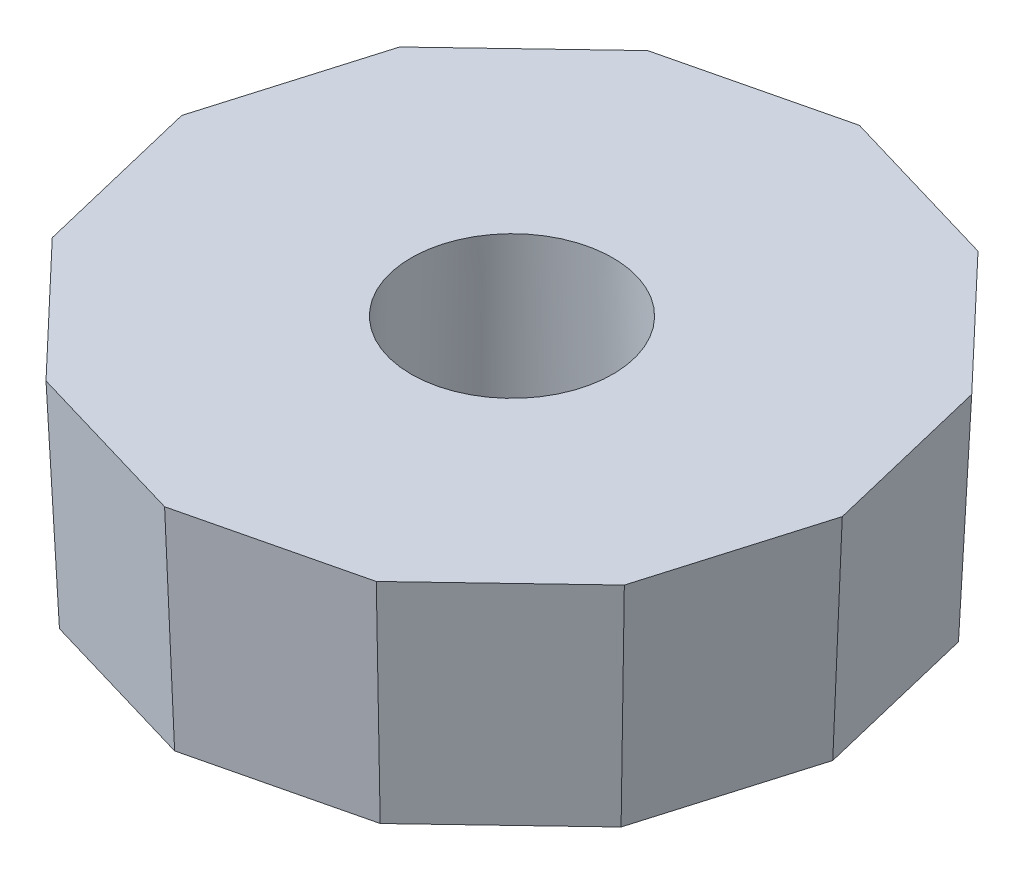
ISO-10303-21;
HEADER;
FILE_DESCRIPTION(('STEP AP214'),'2;1');
FILE_NAME('part.step','',(''),(''),'','','');
FILE_SCHEMA(('AUTOMOTIVE_DESIGN { 1 0 10303 214 1 1 1 1 }'));
ENDSEC;
DATA;
#1=APPLICATION_CONTEXT('core data for automotive mechanical design processes');
#2=APPLICATION_PROTOCOL_DEFINITION('international standard','automotive_design',2000,#1);
#3=PRODUCT_CONTEXT('',#1,'mechanical');
#4=PRODUCT('Part','Part','',(#3));
#5=PRODUCT_RELATED_PRODUCT_CATEGORY('part','',(#4));
#6=PRODUCT_DEFINITION_FORMATION('','',#4);
#7=PRODUCT_DEFINITION_CONTEXT('part definition',#1,'design');
#8=PRODUCT_DEFINITION('design','',#6,#7);
#9=PRODUCT_DEFINITION_SHAPE('','',#8);
#10=(LENGTH_UNIT() NAMED_UNIT(*) SI_UNIT(.MILLI.,.METRE.));
#11=(NAMED_UNIT(*) PLANE_ANGLE_UNIT() SI_UNIT($,.RADIAN.));
#12=(NAMED_UNIT(*) SI_UNIT($,.STERADIAN.) SOLID_ANGLE_UNIT());
#13=UNCERTAINTY_MEASURE_WITH_UNIT(LENGTH_MEASURE(1.E-05),#10,'distance_accuracy_value','');
#14=(GEOMETRIC_REPRESENTATION_CONTEXT(3) GLOBAL_UNCERTAINTY_ASSIGNED_CONTEXT((#13)) GLOBAL_UNIT_ASSIGNED_CONTEXT((#10,
#11,#12)) REPRESENTATION_CONTEXT('',''));
#15=CARTESIAN_POINT('',(0.,0.,0.));
#16=DIRECTION('',(0.,0.,1.));
#17=DIRECTION('',(1.,0.,0.));
#18=AXIS2_PLACEMENT_3D('',#15,#16,#17);
#19=CARTESIAN_POINT('',(0.,6.35,0.));
#20=DIRECTION('',(0.,1.,0.));
#21=DIRECTION('',(0.,0.,1.));
#22=AXIS2_PLACEMENT_3D('',#19,#20,#21);
#23=PLANE('',#22);
#24=DIRECTION('',(-0.724747065615518,0.,0.689015014990019));
#25=VECTOR('',#24,1.);
#26=CARTESIAN_POINT('',(4.81065623202276,6.35,8.69078128216615));
#27=LINE('',#26,#25);
#28=CARTESIAN_POINT('',(4.75681614490191,6.35,8.74196690290838));
#29=VERTEX_POINT('',#28);
#30=CARTESIAN_POINT('',(8.4905070740712,6.35,5.19235734451046));
#31=VERTEX_POINT('',#30);
#32=EDGE_CURVE('E187',#29,#31,#27,.F.);
#33=ORIENTED_EDGE('',*,*,#32,.T.);
#34=DIRECTION('',(-0.283141862646256,0.,0.959078039378031));
#35=VECTOR('',#34,1.);
#36=CARTESIAN_POINT('',(8.51154114688871,6.35,5.1211092530788));
#37=LINE('',#36,#35);
#38=CARTESIAN_POINT('',(9.94917348941238,6.35,0.251459828837172));
#39=VERTEX_POINT('',#38);
#40=EDGE_CURVE('E146',#31,#39,#37,.F.);
#41=ORIENTED_EDGE('',*,*,#40,.T.);
#42=DIRECTION('',(0.234330973762514,0.,0.972156877636275));
#43=VECTOR('',#42,1.);
#44=CARTESIAN_POINT('',(9.93176548510156,6.35,0.17924013527744));
#45=LINE('',#44,#43);
#46=CARTESIAN_POINT('',(8.74196690290837,6.35,-4.75681614490191));
#47=VERTEX_POINT('',#46);
#48=EDGE_CURVE('E233',#39,#47,#45,.F.);
#49=ORIENTED_EDGE('',*,*,#48,.T.);
#50=DIRECTION('',(0.689015014990019,0.,0.724747065615518));
#51=VECTOR('',#50,1.);
#52=CARTESIAN_POINT('',(8.69078128216615,6.35,-4.81065623202276));
#53=LINE('',#52,#51);
#54=CARTESIAN_POINT('',(5.19235734451046,6.35,-8.4905070740712));
#55=VERTEX_POINT('',#54);
#56=EDGE_CURVE('E236',#47,#55,#53,.F.);
#57=ORIENTED_EDGE('',*,*,#56,.T.);
#58=DIRECTION('',(0.959078039378031,0.,0.283141862646256));
#59=VECTOR('',#58,1.);
#60=CARTESIAN_POINT('',(5.1211092530788,6.35,-8.51154114688871));
#61=LINE('',#60,#59);
#62=CARTESIAN_POINT('',(0.25145982883717,6.35,-9.94917348941238));
#63=VERTEX_POINT('',#62);
#64=EDGE_CURVE('E239',#55,#63,#61,.F.);
#65=ORIENTED_EDGE('',*,*,#64,.T.);
#66=DIRECTION('',(0.972156877636275,0.,-0.234330973762514));
#67=VECTOR('',#66,1.);
#68=CARTESIAN_POINT('',(0.179240135277437,6.35,-9.93176548510156));
#69=LINE('',#68,#67);
#70=CARTESIAN_POINT('',(-4.75681614490192,6.35,-8.74196690290837));
#71=VERTEX_POINT('',#70);
#72=EDGE_CURVE('E242',#63,#71,#69,.F.);
#73=ORIENTED_EDGE('',*,*,#72,.T.);
#74=DIRECTION('',(0.724747065615518,0.,-0.689015014990019));
#75=VECTOR('',#74,1.);
#76=CARTESIAN_POINT('',(-4.81065623202276,6.35,-8.69078128216615));
#77=LINE('',#76,#75);
#78=CARTESIAN_POINT('',(-8.4905070740712,6.35,-5.19235734451046));
#79=VERTEX_POINT('',#78);
#80=EDGE_CURVE('E245',#71,#79,#77,.F.);
#81=ORIENTED_EDGE('',*,*,#80,.T.);
#82=DIRECTION('',(0.283141862646257,0.,-0.959078039378031));
#83=VECTOR('',#82,1.);
#84=CARTESIAN_POINT('',(-8.51154114688871,6.35,-5.1211092530788));
#85=LINE('',#84,#83);
#86=CARTESIAN_POINT('',(-9.94917348941238,6.35,-0.251459828837181));
#87=VERTEX_POINT('',#86);
#88=EDGE_CURVE('E248',#79,#87,#85,.F.);
#89=ORIENTED_EDGE('',*,*,#88,.T.);
#90=DIRECTION('',(-0.234330973762514,0.,-0.972156877636276));
#91=VECTOR('',#90,1.);
#92=CARTESIAN_POINT('',(-9.93176548510156,6.35,-0.179240135277448));
#93=LINE('',#92,#91);
#94=CARTESIAN_POINT('',(-8.74196690290837,6.35,4.75681614490192));
#95=VERTEX_POINT('',#94);
#96=EDGE_CURVE('E251',#87,#95,#93,.F.);
#97=ORIENTED_EDGE('',*,*,#96,.T.);
#98=DIRECTION('',(-0.68901501499002,0.,-0.724747065615517));
#99=VECTOR('',#98,1.);
#100=CARTESIAN_POINT('',(-8.69078128216615,6.35,4.81065623202276));
#101=LINE('',#100,#99);
#102=CARTESIAN_POINT('',(-5.19235734451046,6.35,8.4905070740712));
#103=VERTEX_POINT('',#102);
#104=EDGE_CURVE('E254',#95,#103,#101,.F.);
#105=ORIENTED_EDGE('',*,*,#104,.T.);
#106=DIRECTION('',(-0.959078039378031,0.,-0.283141862646256));
#107=VECTOR('',#106,1.);
#108=CARTESIAN_POINT('',(-5.1211092530788,6.35,8.51154114688871));
#109=LINE('',#108,#107);
#110=CARTESIAN_POINT('',(-0.251459828837165,6.35,9.94917348941238));
#111=VERTEX_POINT('',#110);
#112=EDGE_CURVE('E62',#103,#111,#109,.F.);
#113=ORIENTED_EDGE('',*,*,#112,.T.);
#114=DIRECTION('',(-0.972156877636276,0.,0.234330973762514));
#115=VECTOR('',#114,1.);
#116=CARTESIAN_POINT('',(-0.179240135277432,6.35,9.93176548510156));
#117=LINE('',#116,#115);
#118=EDGE_CURVE('E57',#111,#29,#117,.F.);
#119=ORIENTED_EDGE('',*,*,#118,.T.);
#120=EDGE_LOOP('',(#33,#41,#49,#57,#65,#73,#81,#89,#97,#105,#113,#119));
#121=FACE_BOUND('',#120,.T.);
#122=CARTESIAN_POINT('',(0.,6.35,0.));
#123=DIRECTION('',(0.,1.,0.));
#124=DIRECTION('',(0.,0.,1.));
#125=AXIS2_PLACEMENT_3D('',#122,#123,#124);
#126=CIRCLE('',#125,2.96125301253095);
#127=CARTESIAN_POINT('',(0.,6.35,2.96125301253095));
#128=VERTEX_POINT('',#127);
#129=EDGE_CURVE('E43',#128,#128,#126,.T.);
#130=ORIENTED_EDGE('',*,*,#129,.F.);
#131=EDGE_LOOP('',(#130));
#132=FACE_BOUND('',#131,.T.);
#133=ADVANCED_FACE('F39',(#121,#132),#23,.T.);
#134=CARTESIAN_POINT('',(0.,0.,0.));
#135=DIRECTION('',(0.,1.,0.));
#136=DIRECTION('',(0.,0.,1.));
#137=AXIS2_PLACEMENT_3D('',#134,#135,#136);
#138=PLANE('',#137);
#139=DIRECTION('',(0.724747065615518,0.,-0.689015014990019));
#140=VECTOR('',#139,1.);
#141=CARTESIAN_POINT('',(4.61962889479583,0.,8.48984734154722));
#142=LINE('',#141,#140);
#143=CARTESIAN_POINT('',(4.61962889479583,0.,8.48984734154722));
#144=VERTEX_POINT('',#143);
#145=CARTESIAN_POINT('',(8.24563964972343,0.,5.04260902463375));
#146=VERTEX_POINT('',#145);
#147=EDGE_CURVE('E136',#144,#146,#142,.T.);
#148=ORIENTED_EDGE('',*,*,#147,.F.);
#149=DIRECTION('',(0.972156877636275,0.,-0.234330973762513));
#150=VECTOR('',#149,1.);
#151=CARTESIAN_POINT('',(-0.244207691823778,0.,9.66223791942959));
#152=LINE('',#151,#150);
#153=CARTESIAN_POINT('',(-0.244207691823778,0.,9.66223791942959));
#154=VERTEX_POINT('',#153);
#155=EDGE_CURVE('E185',#154,#144,#152,.T.);
#156=ORIENTED_EDGE('',*,*,#155,.F.);
#157=DIRECTION('',(0.959078039378031,0.,0.283141862646256));
#158=VECTOR('',#157,1.);
#159=CARTESIAN_POINT('',(-5.04260902463375,0.,8.24563964972343));
#160=LINE('',#159,#158);
#161=CARTESIAN_POINT('',(-5.04260902463375,0.,8.24563964972343));
#162=VERTEX_POINT('',#161);
#163=EDGE_CURVE('E182',#162,#154,#160,.T.);
#164=ORIENTED_EDGE('',*,*,#163,.F.);
#165=DIRECTION('',(0.68901501499002,0.,0.724747065615517));
#166=VECTOR('',#165,1.);
#167=CARTESIAN_POINT('',(-8.48984734154721,0.,4.61962889479584));
#168=LINE('',#167,#166);
#169=CARTESIAN_POINT('',(-8.48984734154721,0.,4.61962889479584));
#170=VERTEX_POINT('',#169);
#171=EDGE_CURVE('E179',#170,#162,#168,.T.);
#172=ORIENTED_EDGE('',*,*,#171,.F.);
#173=DIRECTION('',(0.234330973762514,0.,0.972156877636276));
#174=VECTOR('',#173,1.);
#175=CARTESIAN_POINT('',(-9.66223791942959,0.,-0.244207691823794));
#176=LINE('',#175,#174);
#177=CARTESIAN_POINT('',(-9.66223791942959,0.,-0.244207691823794));
#178=VERTEX_POINT('',#177);
#179=EDGE_CURVE('E176',#178,#170,#176,.T.);
#180=ORIENTED_EDGE('',*,*,#179,.F.);
#181=DIRECTION('',(-0.283141862646257,0.,0.959078039378031));
#182=VECTOR('',#181,1.);
#183=CARTESIAN_POINT('',(-8.24563964972343,0.,-5.04260902463375));
#184=LINE('',#183,#182);
#185=CARTESIAN_POINT('',(-8.24563964972343,0.,-5.04260902463375));
#186=VERTEX_POINT('',#185);
#187=EDGE_CURVE('E173',#186,#178,#184,.T.);
#188=ORIENTED_EDGE('',*,*,#187,.F.);
#189=DIRECTION('',(-0.724747065615518,0.,0.689015014990019));
#190=VECTOR('',#189,1.);
#191=CARTESIAN_POINT('',(-4.61962889479584,0.,-8.48984734154721));
#192=LINE('',#191,#190);
#193=CARTESIAN_POINT('',(-4.61962889479584,0.,-8.48984734154721));
#194=VERTEX_POINT('',#193);
#195=EDGE_CURVE('E170',#194,#186,#192,.T.);
#196=ORIENTED_EDGE('',*,*,#195,.F.);
#197=DIRECTION('',(-0.972156877636275,0.,0.234330973762514));
#198=VECTOR('',#197,1.);
#199=CARTESIAN_POINT('',(0.244207691823783,0.,-9.66223791942959));
#200=LINE('',#199,#198);
#201=CARTESIAN_POINT('',(0.244207691823783,0.,-9.66223791942959));
#202=VERTEX_POINT('',#201);
#203=EDGE_CURVE('E167',#202,#194,#200,.T.);
#204=ORIENTED_EDGE('',*,*,#203,.F.);
#205=DIRECTION('',(-0.959078039378031,0.,-0.283141862646256));
#206=VECTOR('',#205,1.);
#207=CARTESIAN_POINT('',(5.04260902463375,0.,-8.24563964972343));
#208=LINE('',#207,#206);
#209=CARTESIAN_POINT('',(5.04260902463375,0.,-8.24563964972343));
#210=VERTEX_POINT('',#209);
#211=EDGE_CURVE('E164',#210,#202,#208,.T.);
#212=ORIENTED_EDGE('',*,*,#211,.F.);
#213=DIRECTION('',(-0.689015014990019,0.,-0.724747065615518));
#214=VECTOR('',#213,1.);
#215=CARTESIAN_POINT('',(8.48984734154721,0.,-4.61962889479583));
#216=LINE('',#215,#214);
#217=CARTESIAN_POINT('',(8.48984734154721,0.,-4.61962889479583));
#218=VERTEX_POINT('',#217);
#219=EDGE_CURVE('E161',#218,#210,#216,.T.);
#220=ORIENTED_EDGE('',*,*,#219,.F.);
#221=DIRECTION('',(-0.234330973762514,0.,-0.972156877636275));
#222=VECTOR('',#221,1.);
#223=CARTESIAN_POINT('',(9.66223791942959,0.,0.244207691823786));
#224=LINE('',#223,#222);
#225=CARTESIAN_POINT('',(9.66223791942959,0.,0.244207691823786));
#226=VERTEX_POINT('',#225);
#227=EDGE_CURVE('E138',#226,#218,#224,.T.);
#228=ORIENTED_EDGE('',*,*,#227,.F.);
#229=DIRECTION('',(0.283141862646256,0.,-0.959078039378031));
#230=VECTOR('',#229,1.);
#231=CARTESIAN_POINT('',(8.24563964972343,0.,5.04260902463375));
#232=LINE('',#231,#230);
#233=EDGE_CURVE('E131',#146,#226,#232,.T.);
#234=ORIENTED_EDGE('',*,*,#233,.F.);
#235=EDGE_LOOP('',(#148,#156,#164,#172,#180,#188,#196,#204,#212,#220,#228,#234));
#236=FACE_BOUND('',#235,.T.);
#237=CARTESIAN_POINT('',(0.,0.,0.));
#238=DIRECTION('',(0.,1.,0.));
#239=DIRECTION('',(0.,0.,1.));
#240=AXIS2_PLACEMENT_3D('',#237,#238,#239);
#241=CIRCLE('',#240,3.2385);
#242=CARTESIAN_POINT('',(0.,0.,3.2385));
#243=VERTEX_POINT('',#242);
#244=EDGE_CURVE('E156',#243,#243,#241,.T.);
#245=ORIENTED_EDGE('',*,*,#244,.T.);
#246=EDGE_LOOP('',(#245));
#247=FACE_BOUND('',#246,.T.);
#248=ADVANCED_FACE('F132',(#236,#247),#138,.F.);
#249=CARTESIAN_POINT('',(4.61962889479583,0.,8.48984734154722));
#250=DIRECTION('',(0.688359225368976,-0.0436193873653361,0.724057266999853));
#251=DIRECTION('',(0.724747065615518,0.,-0.689015014990019));
#252=AXIS2_PLACEMENT_3D('',#249,#250,#251);
#253=PLANE('',#252);
#254=ORIENTED_EDGE('',*,*,#147,.T.);
#255=DIRECTION('',(-0.0385224657464174,-0.998979991484418,-0.0235583583173617));
#256=VECTOR('',#255,1.);
#257=CARTESIAN_POINT('',(8.24563964972343,0.,5.04260902463375));
#258=LINE('',#257,#256);
#259=EDGE_CURVE('E11',#31,#146,#258,.T.);
#260=ORIENTED_EDGE('',*,*,#259,.F.);
#261=ORIENTED_EDGE('',*,*,#32,.F.);
#262=DIRECTION('',(-0.0215822547941325,-0.998979991484418,-0.0396633696475004));
#263=VECTOR('',#262,1.);
#264=CARTESIAN_POINT('',(4.61962889479583,0.,8.48984734154722));
#265=LINE('',#264,#263);
#266=EDGE_CURVE('E151',#29,#144,#265,.T.);
#267=ORIENTED_EDGE('',*,*,#266,.T.);
#268=EDGE_LOOP('',(#254,#260,#261,#267));
#269=FACE_BOUND('',#268,.T.);
#270=ADVANCED_FACE('F150',(#269),#253,.T.);
#271=CARTESIAN_POINT('',(8.24563964972343,0.,5.04260902463375));
#272=DIRECTION('',(0.958165209598837,-0.0436193873653361,0.282872374332117));
#273=DIRECTION('',(0.283141862646256,0.,-0.959078039378031));
#274=AXIS2_PLACEMENT_3D('',#271,#272,#273);
#275=PLANE('',#274);
#276=ORIENTED_EDGE('',*,*,#233,.T.);
#277=DIRECTION('',(-0.0451406131114942,-0.998979991484418,-0.00114090390108293));
#278=VECTOR('',#277,1.);
#279=CARTESIAN_POINT('',(9.66223791942959,0.,0.244207691823786));
#280=LINE('',#279,#278);
#281=EDGE_CURVE('E49',#39,#226,#280,.T.);
#282=ORIENTED_EDGE('',*,*,#281,.F.);
#283=ORIENTED_EDGE('',*,*,#40,.F.);
#284=ORIENTED_EDGE('',*,*,#259,.T.);
#285=EDGE_LOOP('',(#276,#282,#283,#284));
#286=FACE_BOUND('',#285,.T.);
#287=ADVANCED_FACE('F145',(#286),#275,.T.);
#288=CARTESIAN_POINT('',(9.66223791942959,0.,0.244207691823786));
#289=DIRECTION('',(0.971231599701093,-0.0436193873653361,-0.234107942598984));
#290=DIRECTION('',(-0.234330973762514,0.,-0.972156877636275));
#291=AXIS2_PLACEMENT_3D('',#288,#289,#290);
#292=PLANE('',#291);
#293=ORIENTED_EDGE('',*,*,#227,.T.);
#294=DIRECTION('',(-0.0396633696475004,-0.998979991484418,0.0215822547941325));
#295=VECTOR('',#294,1.);
#296=CARTESIAN_POINT('',(8.48984734154721,0.,-4.61962889479583));
#297=LINE('',#296,#295);
#298=EDGE_CURVE('E223',#47,#218,#297,.T.);
#299=ORIENTED_EDGE('',*,*,#298,.F.);
#300=ORIENTED_EDGE('',*,*,#48,.F.);
#301=ORIENTED_EDGE('',*,*,#281,.T.);
#302=EDGE_LOOP('',(#293,#299,#300,#301));
#303=FACE_BOUND('',#302,.T.);
#304=ADVANCED_FACE('F275',(#303),#292,.T.);
#305=CARTESIAN_POINT('',(8.48984734154721,0.,-4.61962889479583));
#306=DIRECTION('',(0.724057266999853,-0.0436193873653361,-0.688359225368976));
#307=DIRECTION('',(-0.689015014990019,0.,-0.724747065615518));
#308=AXIS2_PLACEMENT_3D('',#305,#306,#307);
#309=PLANE('',#308);
#310=ORIENTED_EDGE('',*,*,#219,.T.);
#311=DIRECTION('',(-0.0235583583173616,-0.998979991484418,0.0385224657464175));
#312=VECTOR('',#311,1.);
#313=CARTESIAN_POINT('',(5.04260902463375,0.,-8.24563964972343));
#314=LINE('',#313,#312);
#315=EDGE_CURVE('E219',#55,#210,#314,.T.);
#316=ORIENTED_EDGE('',*,*,#315,.F.);
#317=ORIENTED_EDGE('',*,*,#56,.F.);
#318=ORIENTED_EDGE('',*,*,#298,.T.);
#319=EDGE_LOOP('',(#310,#316,#317,#318));
#320=FACE_BOUND('',#319,.T.);
#321=ADVANCED_FACE('F279',(#320),#309,.T.);
#322=CARTESIAN_POINT('',(5.04260902463375,0.,-8.24563964972343));
#323=DIRECTION('',(0.282872374332117,-0.0436193873653361,-0.958165209598837));
#324=DIRECTION('',(-0.959078039378031,0.,-0.283141862646256));
#325=AXIS2_PLACEMENT_3D('',#322,#323,#324);
#326=PLANE('',#325);
#327=ORIENTED_EDGE('',*,*,#211,.T.);
#328=DIRECTION('',(-0.00114090390108291,-0.998979991484418,0.0451406131114942));
#329=VECTOR('',#328,1.);
#330=CARTESIAN_POINT('',(0.244207691823783,0.,-9.66223791942959));
#331=LINE('',#330,#329);
#332=EDGE_CURVE('E215',#63,#202,#331,.T.);
#333=ORIENTED_EDGE('',*,*,#332,.F.);
#334=ORIENTED_EDGE('',*,*,#64,.F.);
#335=ORIENTED_EDGE('',*,*,#315,.T.);
#336=EDGE_LOOP('',(#327,#333,#334,#335));
#337=FACE_BOUND('',#336,.T.);
#338=ADVANCED_FACE('F285',(#337),#326,.T.);
#339=CARTESIAN_POINT('',(0.244207691823783,0.,-9.66223791942959));
#340=DIRECTION('',(-0.234107942598985,-0.0436193873653361,-0.971231599701093));
#341=DIRECTION('',(-0.972156877636275,0.,0.234330973762514));
#342=AXIS2_PLACEMENT_3D('',#339,#340,#341);
#343=PLANE('',#342);
#344=ORIENTED_EDGE('',*,*,#203,.T.);
#345=DIRECTION('',(0.0215822547941325,-0.998979991484417,0.0396633696475003));
#346=VECTOR('',#345,1.);
#347=CARTESIAN_POINT('',(-4.61962889479584,0.,-8.48984734154721));
#348=LINE('',#347,#346);
#349=EDGE_CURVE('E211',#71,#194,#348,.T.);
#350=ORIENTED_EDGE('',*,*,#349,.F.);
#351=ORIENTED_EDGE('',*,*,#72,.F.);
#352=ORIENTED_EDGE('',*,*,#332,.T.);
#353=EDGE_LOOP('',(#344,#350,#351,#352));
#354=FACE_BOUND('',#353,.T.);
#355=ADVANCED_FACE('F289',(#354),#343,.T.);
#356=CARTESIAN_POINT('',(-4.61962889479584,0.,-8.48984734154721));
#357=DIRECTION('',(-0.688359225368976,-0.0436193873653361,-0.724057266999853));
#358=DIRECTION('',(-0.724747065615518,0.,0.689015014990019));
#359=AXIS2_PLACEMENT_3D('',#356,#357,#358);
#360=PLANE('',#359);
#361=ORIENTED_EDGE('',*,*,#195,.T.);
#362=DIRECTION('',(0.0385224657464174,-0.998979991484418,0.0235583583173617));
#363=VECTOR('',#362,1.);
#364=CARTESIAN_POINT('',(-8.24563964972343,0.,-5.04260902463375));
#365=LINE('',#364,#363);
#366=EDGE_CURVE('E207',#79,#186,#365,.T.);
#367=ORIENTED_EDGE('',*,*,#366,.F.);
#368=ORIENTED_EDGE('',*,*,#80,.F.);
#369=ORIENTED_EDGE('',*,*,#349,.T.);
#370=EDGE_LOOP('',(#361,#367,#368,#369));
#371=FACE_BOUND('',#370,.T.);
#372=ADVANCED_FACE('F294',(#371),#360,.T.);
#373=CARTESIAN_POINT('',(-8.24563964972343,0.,-5.04260902463375));
#374=DIRECTION('',(-0.958165209598837,-0.0436193873653361,-0.282872374332118));
#375=DIRECTION('',(-0.283141862646257,0.,0.959078039378031));
#376=AXIS2_PLACEMENT_3D('',#373,#374,#375);
#377=PLANE('',#376);
#378=ORIENTED_EDGE('',*,*,#187,.T.);
#379=DIRECTION('',(0.0451406131114942,-0.998979991484418,0.00114090390108297));
#380=VECTOR('',#379,1.);
#381=CARTESIAN_POINT('',(-9.66223791942959,0.,-0.244207691823794));
#382=LINE('',#381,#380);
#383=EDGE_CURVE('E203',#87,#178,#382,.T.);
#384=ORIENTED_EDGE('',*,*,#383,.F.);
#385=ORIENTED_EDGE('',*,*,#88,.F.);
#386=ORIENTED_EDGE('',*,*,#366,.T.);
#387=EDGE_LOOP('',(#378,#384,#385,#386));
#388=FACE_BOUND('',#387,.T.);
#389=ADVANCED_FACE('F298',(#388),#377,.T.);
#390=CARTESIAN_POINT('',(-9.66223791942959,0.,-0.244207691823794));
#391=DIRECTION('',(-0.971231599701093,-0.0436193873653361,0.234107942598984));
#392=DIRECTION('',(0.234330973762514,0.,0.972156877636276));
#393=AXIS2_PLACEMENT_3D('',#390,#391,#392);
#394=PLANE('',#393);
#395=ORIENTED_EDGE('',*,*,#179,.T.);
#396=DIRECTION('',(0.0396633696475003,-0.998979991484418,-0.0215822547941325));
#397=VECTOR('',#396,1.);
#398=CARTESIAN_POINT('',(-8.48984734154721,0.,4.61962889479584));
#399=LINE('',#398,#397);
#400=EDGE_CURVE('E199',#95,#170,#399,.T.);
#401=ORIENTED_EDGE('',*,*,#400,.F.);
#402=ORIENTED_EDGE('',*,*,#96,.F.);
#403=ORIENTED_EDGE('',*,*,#383,.T.);
#404=EDGE_LOOP('',(#395,#401,#402,#403));
#405=FACE_BOUND('',#404,.T.);
#406=ADVANCED_FACE('F302',(#405),#394,.T.);
#407=CARTESIAN_POINT('',(-8.48984734154721,0.,4.61962889479584));
#408=DIRECTION('',(-0.724057266999853,-0.0436193873653361,0.688359225368976));
#409=DIRECTION('',(0.68901501499002,0.,0.724747065615517));
#410=AXIS2_PLACEMENT_3D('',#407,#408,#409);
#411=PLANE('',#410);
#412=ORIENTED_EDGE('',*,*,#171,.T.);
#413=DIRECTION('',(0.0235583583173617,-0.998979991484418,-0.0385224657464174));
#414=VECTOR('',#413,1.);
#415=CARTESIAN_POINT('',(-5.04260902463375,0.,8.24563964972343));
#416=LINE('',#415,#414);
#417=EDGE_CURVE('E195',#103,#162,#416,.T.);
#418=ORIENTED_EDGE('',*,*,#417,.F.);
#419=ORIENTED_EDGE('',*,*,#104,.F.);
#420=ORIENTED_EDGE('',*,*,#400,.T.);
#421=EDGE_LOOP('',(#412,#418,#419,#420));
#422=FACE_BOUND('',#421,.T.);
#423=ADVANCED_FACE('F265',(#422),#411,.T.);
#424=CARTESIAN_POINT('',(-5.04260902463375,0.,8.24563964972343));
#425=DIRECTION('',(-0.282872374332117,-0.0436193873653361,0.958165209598837));
#426=DIRECTION('',(0.959078039378031,0.,0.283141862646256));
#427=AXIS2_PLACEMENT_3D('',#424,#425,#426);
#428=PLANE('',#427);
#429=ORIENTED_EDGE('',*,*,#163,.T.);
#430=DIRECTION('',(0.00114090390108291,-0.998979991484418,-0.0451406131114942));
#431=VECTOR('',#430,1.);
#432=CARTESIAN_POINT('',(-0.244207691823778,0.,9.66223791942959));
#433=LINE('',#432,#431);
#434=EDGE_CURVE('E191',#111,#154,#433,.T.);
#435=ORIENTED_EDGE('',*,*,#434,.F.);
#436=ORIENTED_EDGE('',*,*,#112,.F.);
#437=ORIENTED_EDGE('',*,*,#417,.T.);
#438=EDGE_LOOP('',(#429,#435,#436,#437));
#439=FACE_BOUND('',#438,.T.);
#440=ADVANCED_FACE('F269',(#439),#428,.T.);
#441=CARTESIAN_POINT('',(-0.244207691823778,0.,9.66223791942959));
#442=DIRECTION('',(0.234107942598984,-0.0436193873653361,0.971231599701093));
#443=DIRECTION('',(0.972156877636276,0.,-0.234330973762514));
#444=AXIS2_PLACEMENT_3D('',#441,#442,#443);
#445=PLANE('',#444);
#446=ORIENTED_EDGE('',*,*,#155,.T.);
#447=ORIENTED_EDGE('',*,*,#266,.F.);
#448=ORIENTED_EDGE('',*,*,#118,.F.);
#449=ORIENTED_EDGE('',*,*,#434,.T.);
#450=EDGE_LOOP('',(#446,#447,#448,#449));
#451=FACE_BOUND('',#450,.T.);
#452=ADVANCED_FACE('F271',(#451),#445,.T.);
#453=CARTESIAN_POINT('',(0.,0.,0.));
#454=DIRECTION('',(0.,-1.,0.));
#455=DIRECTION('',(0.,0.,1.));
#456=AXIS2_PLACEMENT_3D('',#453,#454,#455);
#457=CONICAL_SURFACE('',#456,3.2385,0.0436332312998583);
#458=ORIENTED_EDGE('',*,*,#129,.T.);
#459=EDGE_LOOP('',(#458));
#460=FACE_BOUND('',#459,.T.);
#461=ORIENTED_EDGE('',*,*,#244,.F.);
#462=EDGE_LOOP('',(#461));
#463=FACE_BOUND('',#462,.T.);
#464=ADVANCED_FACE('F41',(#460,#463),#457,.F.);
#465=CLOSED_SHELL('',(#133,#248,#270,#287,#304,#321,#338,#355,#372,#389,#406,#423,#440,#452,#464));
#466=MANIFOLD_SOLID_BREP('B2',#465);
#467=ADVANCED_BREP_SHAPE_REPRESENTATION('',(#18,#466),#14);
#468=SHAPE_DEFINITION_REPRESENTATION(#9,#467);
ENDSEC;
END-ISO-10303-21;
